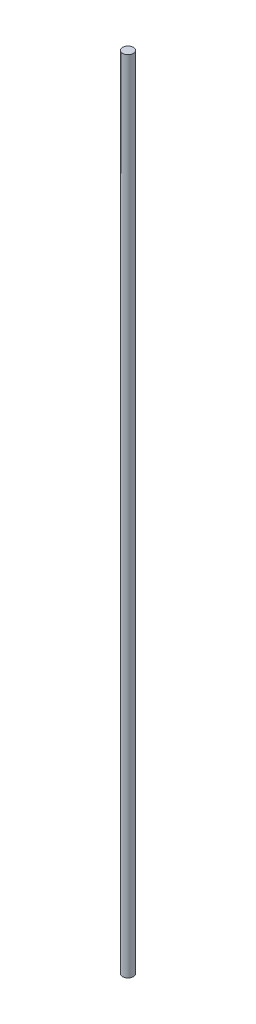
ISO-10303-21;
HEADER;
FILE_DESCRIPTION(('STEP AP214'),'2;1');
FILE_NAME('part.step','',(''),(''),'','','');
FILE_SCHEMA(('AUTOMOTIVE_DESIGN { 1 0 10303 214 1 1 1 1 }'));
ENDSEC;
DATA;
#1=APPLICATION_CONTEXT('core data for automotive mechanical design processes');
#2=APPLICATION_PROTOCOL_DEFINITION('international standard','automotive_design',2000,#1);
#3=PRODUCT_CONTEXT('',#1,'mechanical');
#4=PRODUCT('Part','Part','',(#3));
#5=PRODUCT_RELATED_PRODUCT_CATEGORY('part','',(#4));
#6=PRODUCT_DEFINITION_FORMATION('','',#4);
#7=PRODUCT_DEFINITION_CONTEXT('part definition',#1,'design');
#8=PRODUCT_DEFINITION('design','',#6,#7);
#9=PRODUCT_DEFINITION_SHAPE('','',#8);
#10=(LENGTH_UNIT() NAMED_UNIT(*) SI_UNIT(.MILLI.,.METRE.));
#11=(NAMED_UNIT(*) PLANE_ANGLE_UNIT() SI_UNIT($,.RADIAN.));
#12=(NAMED_UNIT(*) SI_UNIT($,.STERADIAN.) SOLID_ANGLE_UNIT());
#13=UNCERTAINTY_MEASURE_WITH_UNIT(LENGTH_MEASURE(1.E-05),#10,'distance_accuracy_value','');
#14=(GEOMETRIC_REPRESENTATION_CONTEXT(3) GLOBAL_UNCERTAINTY_ASSIGNED_CONTEXT((#13)) GLOBAL_UNIT_ASSIGNED_CONTEXT((#10,
#11,#12)) REPRESENTATION_CONTEXT('',''));
#15=CARTESIAN_POINT('',(0.,0.,0.));
#16=DIRECTION('',(0.,0.,1.));
#17=DIRECTION('',(1.,0.,0.));
#18=AXIS2_PLACEMENT_3D('',#15,#16,#17);
#19=CARTESIAN_POINT('',(0.,600.,0.));
#20=DIRECTION('',(0.,-1.,0.));
#21=DIRECTION('',(0.,0.,-1.));
#22=AXIS2_PLACEMENT_3D('',#19,#20,#21);
#23=CYLINDRICAL_SURFACE('',#22,4.);
#24=CARTESIAN_POINT('',(0.,600.,0.));
#25=DIRECTION('',(0.,1.,0.));
#26=DIRECTION('',(0.,0.,1.));
#27=AXIS2_PLACEMENT_3D('',#24,#25,#26);
#28=CIRCLE('',#27,4.);
#29=CARTESIAN_POINT('',(0.,600.,4.));
#30=VERTEX_POINT('',#29);
#31=EDGE_CURVE('E10',#30,#30,#28,.T.);
#32=ORIENTED_EDGE('',*,*,#31,.F.);
#33=EDGE_LOOP('',(#32));
#34=FACE_BOUND('',#33,.T.);
#35=CARTESIAN_POINT('',(0.,0.,0.));
#36=DIRECTION('',(0.,1.,0.));
#37=DIRECTION('',(0.,0.,1.));
#38=AXIS2_PLACEMENT_3D('',#35,#36,#37);
#39=CIRCLE('',#38,4.);
#40=CARTESIAN_POINT('',(0.,0.,4.));
#41=VERTEX_POINT('',#40);
#42=EDGE_CURVE('E40',#41,#41,#39,.T.);
#43=ORIENTED_EDGE('',*,*,#42,.T.);
#44=EDGE_LOOP('',(#43));
#45=FACE_BOUND('',#44,.T.);
#46=ADVANCED_FACE('F37',(#34,#45),#23,.T.);
#47=CARTESIAN_POINT('',(0.,600.,0.));
#48=DIRECTION('',(0.,1.,0.));
#49=DIRECTION('',(0.,0.,1.));
#50=AXIS2_PLACEMENT_3D('',#47,#48,#49);
#51=PLANE('',#50);
#52=ORIENTED_EDGE('',*,*,#31,.T.);
#53=EDGE_LOOP('',(#52));
#54=FACE_BOUND('',#53,.T.);
#55=ADVANCED_FACE('F52',(#54),#51,.T.);
#56=CARTESIAN_POINT('',(0.,0.,0.));
#57=DIRECTION('',(0.,1.,0.));
#58=DIRECTION('',(0.,0.,1.));
#59=AXIS2_PLACEMENT_3D('',#56,#57,#58);
#60=PLANE('',#59);
#61=ORIENTED_EDGE('',*,*,#42,.F.);
#62=EDGE_LOOP('',(#61));
#63=FACE_BOUND('',#62,.T.);
#64=ADVANCED_FACE('F50',(#63),#60,.F.);
#65=CLOSED_SHELL('',(#46,#55,#64));
#66=MANIFOLD_SOLID_BREP('B2',#65);
#67=ADVANCED_BREP_SHAPE_REPRESENTATION('',(#18,#66),#14);
#68=SHAPE_DEFINITION_REPRESENTATION(#9,#67);
ENDSEC;
END-ISO-10303-21;
